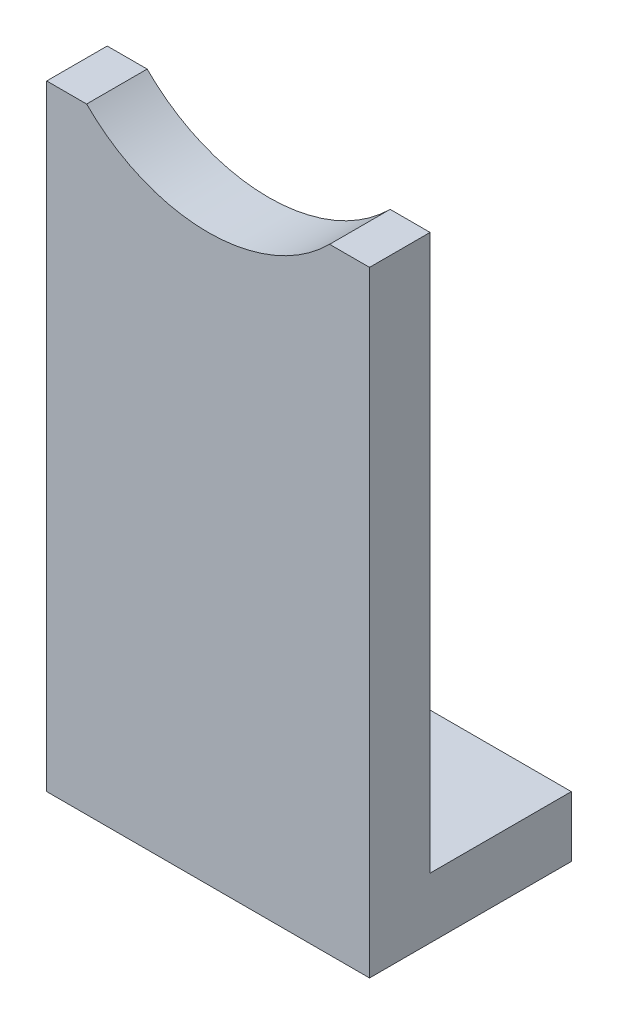
ISO-10303-21;
HEADER;
FILE_DESCRIPTION(('STEP AP214'),'2;1');
FILE_NAME('part.step','',(''),(''),'','','');
FILE_SCHEMA(('AUTOMOTIVE_DESIGN { 1 0 10303 214 1 1 1 1 }'));
ENDSEC;
DATA;
#1=APPLICATION_CONTEXT('core data for automotive mechanical design processes');
#2=APPLICATION_PROTOCOL_DEFINITION('international standard','automotive_design',2000,#1);
#3=PRODUCT_CONTEXT('',#1,'mechanical');
#4=PRODUCT('Part','Part','',(#3));
#5=PRODUCT_RELATED_PRODUCT_CATEGORY('part','',(#4));
#6=PRODUCT_DEFINITION_FORMATION('','',#4);
#7=PRODUCT_DEFINITION_CONTEXT('part definition',#1,'design');
#8=PRODUCT_DEFINITION('design','',#6,#7);
#9=PRODUCT_DEFINITION_SHAPE('','',#8);
#10=(LENGTH_UNIT() NAMED_UNIT(*) SI_UNIT(.MILLI.,.METRE.));
#11=(NAMED_UNIT(*) PLANE_ANGLE_UNIT() SI_UNIT($,.RADIAN.));
#12=(NAMED_UNIT(*) SI_UNIT($,.STERADIAN.) SOLID_ANGLE_UNIT());
#13=UNCERTAINTY_MEASURE_WITH_UNIT(LENGTH_MEASURE(1.E-05),#10,'distance_accuracy_value','');
#14=(GEOMETRIC_REPRESENTATION_CONTEXT(3) GLOBAL_UNCERTAINTY_ASSIGNED_CONTEXT((#13)) GLOBAL_UNIT_ASSIGNED_CONTEXT((#10,
#11,#12)) REPRESENTATION_CONTEXT('',''));
#15=CARTESIAN_POINT('',(0.,0.,0.));
#16=DIRECTION('',(0.,0.,1.));
#17=DIRECTION('',(1.,0.,0.));
#18=AXIS2_PLACEMENT_3D('',#15,#16,#17);
#19=CARTESIAN_POINT('',(0.,61.,0.));
#20=DIRECTION('',(0.,1.,0.));
#21=DIRECTION('',(0.,0.,1.));
#22=AXIS2_PLACEMENT_3D('',#19,#20,#21);
#23=PLANE('',#22);
#24=DIRECTION('',(0.,0.,1.));
#25=VECTOR('',#24,1.);
#26=CARTESIAN_POINT('',(-12.0415945787923,61.,-56.5606936416204));
#27=LINE('',#26,#25);
#28=CARTESIAN_POINT('',(-12.0415945787923,61.,-7.56069364162039));
#29=VERTEX_POINT('',#28);
#30=CARTESIAN_POINT('',(-12.0415945787923,61.,-1.56069364162039));
#31=VERTEX_POINT('',#30);
#32=EDGE_CURVE('E11',#29,#31,#27,.T.);
#33=ORIENTED_EDGE('',*,*,#32,.F.);
#34=DIRECTION('',(-1.,0.,0.));
#35=VECTOR('',#34,1.);
#36=CARTESIAN_POINT('',(16.,61.,-7.56069364162039));
#37=LINE('',#36,#35);
#38=CARTESIAN_POINT('',(-16.,61.,-7.56069364162039));
#39=VERTEX_POINT('',#38);
#40=EDGE_CURVE('E185',#29,#39,#37,.T.);
#41=ORIENTED_EDGE('',*,*,#40,.T.);
#42=DIRECTION('',(0.,0.,1.));
#43=VECTOR('',#42,1.);
#44=CARTESIAN_POINT('',(-16.,61.,-1.56069364162039));
#45=LINE('',#44,#43);
#46=CARTESIAN_POINT('',(-16.,61.,-1.56069364162039));
#47=VERTEX_POINT('',#46);
#48=EDGE_CURVE('E113',#39,#47,#45,.T.);
#49=ORIENTED_EDGE('',*,*,#48,.T.);
#50=DIRECTION('',(1.,0.,0.));
#51=VECTOR('',#50,1.);
#52=CARTESIAN_POINT('',(16.,61.,-1.56069364162039));
#53=LINE('',#52,#51);
#54=EDGE_CURVE('E107',#47,#31,#53,.T.);
#55=ORIENTED_EDGE('',*,*,#54,.T.);
#56=EDGE_LOOP('',(#33,#41,#49,#55));
#57=FACE_BOUND('',#56,.T.);
#58=ADVANCED_FACE('F34',(#57),#23,.T.);
#59=CARTESIAN_POINT('',(16.,6.,-21.5606936416204));
#60=DIRECTION('',(-1.,0.,0.));
#61=DIRECTION('',(0.,0.,1.));
#62=AXIS2_PLACEMENT_3D('',#59,#60,#61);
#63=PLANE('',#62);
#64=DIRECTION('',(0.,0.,-1.));
#65=VECTOR('',#64,1.);
#66=CARTESIAN_POINT('',(16.,0.,-21.5606936416204));
#67=LINE('',#66,#65);
#68=CARTESIAN_POINT('',(16.,0.,-1.56069364162039));
#69=VERTEX_POINT('',#68);
#70=CARTESIAN_POINT('',(16.,0.,-21.5606936416204));
#71=VERTEX_POINT('',#70);
#72=EDGE_CURVE('E137',#69,#71,#67,.T.);
#73=ORIENTED_EDGE('',*,*,#72,.T.);
#74=DIRECTION('',(0.,-1.,0.));
#75=VECTOR('',#74,1.);
#76=CARTESIAN_POINT('',(16.,6.,-21.5606936416204));
#77=LINE('',#76,#75);
#78=CARTESIAN_POINT('',(16.,6.,-21.5606936416204));
#79=VERTEX_POINT('',#78);
#80=EDGE_CURVE('E139',#79,#71,#77,.T.);
#81=ORIENTED_EDGE('',*,*,#80,.F.);
#82=DIRECTION('',(0.,0.,-1.));
#83=VECTOR('',#82,1.);
#84=CARTESIAN_POINT('',(16.,6.,-21.5606936416204));
#85=LINE('',#84,#83);
#86=CARTESIAN_POINT('',(16.,6.,-7.56069364162039));
#87=VERTEX_POINT('',#86);
#88=EDGE_CURVE('E151',#87,#79,#85,.T.);
#89=ORIENTED_EDGE('',*,*,#88,.F.);
#90=DIRECTION('',(0.,-1.,0.));
#91=VECTOR('',#90,1.);
#92=CARTESIAN_POINT('',(16.,61.,-7.56069364162039));
#93=LINE('',#92,#91);
#94=CARTESIAN_POINT('',(16.,61.,-7.56069364162039));
#95=VERTEX_POINT('',#94);
#96=EDGE_CURVE('E117',#95,#87,#93,.T.);
#97=ORIENTED_EDGE('',*,*,#96,.F.);
#98=DIRECTION('',(0.,0.,-1.));
#99=VECTOR('',#98,1.);
#100=CARTESIAN_POINT('',(16.,61.,-1.56069364162039));
#101=LINE('',#100,#99);
#102=CARTESIAN_POINT('',(16.,61.,-1.56069364162039));
#103=VERTEX_POINT('',#102);
#104=EDGE_CURVE('E128',#103,#95,#101,.T.);
#105=ORIENTED_EDGE('',*,*,#104,.F.);
#106=DIRECTION('',(0.,-1.,0.));
#107=VECTOR('',#106,1.);
#108=CARTESIAN_POINT('',(16.,6.,-1.56069364162039));
#109=LINE('',#108,#107);
#110=EDGE_CURVE('E162',#103,#69,#109,.T.);
#111=ORIENTED_EDGE('',*,*,#110,.T.);
#112=EDGE_LOOP('',(#73,#81,#89,#97,#105,#111));
#113=FACE_BOUND('',#112,.T.);
#114=ADVANCED_FACE('F36',(#113),#63,.F.);
#115=CARTESIAN_POINT('',(-16.,6.,-21.5606936416204));
#116=DIRECTION('',(0.,0.,1.));
#117=DIRECTION('',(1.,0.,0.));
#118=AXIS2_PLACEMENT_3D('',#115,#116,#117);
#119=PLANE('',#118);
#120=DIRECTION('',(-1.,0.,0.));
#121=VECTOR('',#120,1.);
#122=CARTESIAN_POINT('',(-16.,0.,-21.5606936416204));
#123=LINE('',#122,#121);
#124=CARTESIAN_POINT('',(-16.,0.,-21.5606936416204));
#125=VERTEX_POINT('',#124);
#126=EDGE_CURVE('E158',#71,#125,#123,.T.);
#127=ORIENTED_EDGE('',*,*,#126,.T.);
#128=DIRECTION('',(0.,-1.,0.));
#129=VECTOR('',#128,1.);
#130=CARTESIAN_POINT('',(-16.,6.,-21.5606936416204));
#131=LINE('',#130,#129);
#132=CARTESIAN_POINT('',(-16.,6.,-21.5606936416204));
#133=VERTEX_POINT('',#132);
#134=EDGE_CURVE('E141',#133,#125,#131,.T.);
#135=ORIENTED_EDGE('',*,*,#134,.F.);
#136=DIRECTION('',(-1.,0.,0.));
#137=VECTOR('',#136,1.);
#138=CARTESIAN_POINT('',(-16.,6.,-21.5606936416204));
#139=LINE('',#138,#137);
#140=EDGE_CURVE('E152',#79,#133,#139,.T.);
#141=ORIENTED_EDGE('',*,*,#140,.F.);
#142=ORIENTED_EDGE('',*,*,#80,.T.);
#143=EDGE_LOOP('',(#127,#135,#141,#142));
#144=FACE_BOUND('',#143,.T.);
#145=ADVANCED_FACE('F172',(#144),#119,.F.);
#146=CARTESIAN_POINT('',(-16.,6.,-21.5606936416204));
#147=DIRECTION('',(1.,0.,0.));
#148=DIRECTION('',(0.,0.,-1.));
#149=AXIS2_PLACEMENT_3D('',#146,#147,#148);
#150=PLANE('',#149);
#151=DIRECTION('',(0.,0.,1.));
#152=VECTOR('',#151,1.);
#153=CARTESIAN_POINT('',(-16.,0.,-21.5606936416204));
#154=LINE('',#153,#152);
#155=CARTESIAN_POINT('',(-16.,0.,-1.56069364162039));
#156=VERTEX_POINT('',#155);
#157=EDGE_CURVE('E154',#125,#156,#154,.T.);
#158=ORIENTED_EDGE('',*,*,#157,.T.);
#159=DIRECTION('',(0.,-1.,0.));
#160=VECTOR('',#159,1.);
#161=CARTESIAN_POINT('',(-16.,6.,-1.56069364162039));
#162=LINE('',#161,#160);
#163=EDGE_CURVE('E148',#47,#156,#162,.T.);
#164=ORIENTED_EDGE('',*,*,#163,.F.);
#165=ORIENTED_EDGE('',*,*,#48,.F.);
#166=DIRECTION('',(0.,-1.,0.));
#167=VECTOR('',#166,1.);
#168=CARTESIAN_POINT('',(-16.,61.,-7.56069364162039));
#169=LINE('',#168,#167);
#170=CARTESIAN_POINT('',(-16.,6.,-7.56069364162039));
#171=VERTEX_POINT('',#170);
#172=EDGE_CURVE('E114',#39,#171,#169,.T.);
#173=ORIENTED_EDGE('',*,*,#172,.T.);
#174=DIRECTION('',(0.,0.,1.));
#175=VECTOR('',#174,1.);
#176=CARTESIAN_POINT('',(-16.,6.,-21.5606936416204));
#177=LINE('',#176,#175);
#178=EDGE_CURVE('E129',#133,#171,#177,.T.);
#179=ORIENTED_EDGE('',*,*,#178,.F.);
#180=ORIENTED_EDGE('',*,*,#134,.T.);
#181=EDGE_LOOP('',(#158,#164,#165,#173,#179,#180));
#182=FACE_BOUND('',#181,.T.);
#183=ADVANCED_FACE('F174',(#182),#150,.F.);
#184=CARTESIAN_POINT('',(-16.,6.,-1.56069364162039));
#185=DIRECTION('',(0.,0.,-1.));
#186=DIRECTION('',(-1.,0.,0.));
#187=AXIS2_PLACEMENT_3D('',#184,#185,#186);
#188=PLANE('',#187);
#189=CARTESIAN_POINT('',(12.0415945787923,61.,-1.56069364162039));
#190=VERTEX_POINT('',#189);
#191=EDGE_CURVE('E109',#190,#103,#53,.T.);
#192=ORIENTED_EDGE('',*,*,#191,.F.);
#193=CARTESIAN_POINT('',(0.,73.,-1.56069364162039));
#194=DIRECTION('',(0.,0.,1.));
#195=DIRECTION('',(1.,0.,0.));
#196=AXIS2_PLACEMENT_3D('',#193,#194,#195);
#197=CIRCLE('',#196,17.);
#198=EDGE_CURVE('E48',#31,#190,#197,.T.);
#199=ORIENTED_EDGE('',*,*,#198,.F.);
#200=ORIENTED_EDGE('',*,*,#54,.F.);
#201=ORIENTED_EDGE('',*,*,#163,.T.);
#202=DIRECTION('',(1.,0.,0.));
#203=VECTOR('',#202,1.);
#204=CARTESIAN_POINT('',(-16.,0.,-1.56069364162039));
#205=LINE('',#204,#203);
#206=EDGE_CURVE('E153',#156,#69,#205,.T.);
#207=ORIENTED_EDGE('',*,*,#206,.T.);
#208=ORIENTED_EDGE('',*,*,#110,.F.);
#209=EDGE_LOOP('',(#192,#199,#200,#201,#207,#208));
#210=FACE_BOUND('',#209,.T.);
#211=ADVANCED_FACE('F105',(#210),#188,.F.);
#212=CARTESIAN_POINT('',(0.,6.,0.));
#213=DIRECTION('',(0.,1.,0.));
#214=DIRECTION('',(0.,0.,1.));
#215=AXIS2_PLACEMENT_3D('',#212,#213,#214);
#216=PLANE('',#215);
#217=DIRECTION('',(-1.,0.,0.));
#218=VECTOR('',#217,1.);
#219=CARTESIAN_POINT('',(16.,6.,-7.56069364162039));
#220=LINE('',#219,#218);
#221=EDGE_CURVE('E56',#87,#171,#220,.T.);
#222=ORIENTED_EDGE('',*,*,#221,.F.);
#223=ORIENTED_EDGE('',*,*,#88,.T.);
#224=ORIENTED_EDGE('',*,*,#140,.T.);
#225=ORIENTED_EDGE('',*,*,#178,.T.);
#226=EDGE_LOOP('',(#222,#223,#224,#225));
#227=FACE_BOUND('',#226,.T.);
#228=ADVANCED_FACE('F176',(#227),#216,.T.);
#229=CARTESIAN_POINT('',(0.,0.,0.));
#230=DIRECTION('',(0.,1.,0.));
#231=DIRECTION('',(0.,0.,1.));
#232=AXIS2_PLACEMENT_3D('',#229,#230,#231);
#233=PLANE('',#232);
#234=ORIENTED_EDGE('',*,*,#72,.F.);
#235=ORIENTED_EDGE('',*,*,#206,.F.);
#236=ORIENTED_EDGE('',*,*,#157,.F.);
#237=ORIENTED_EDGE('',*,*,#126,.F.);
#238=EDGE_LOOP('',(#234,#235,#236,#237));
#239=FACE_BOUND('',#238,.T.);
#240=ADVANCED_FACE('F167',(#239),#233,.F.);
#241=CARTESIAN_POINT('',(16.,61.,-7.56069364162039));
#242=DIRECTION('',(0.,0.,1.));
#243=DIRECTION('',(1.,0.,0.));
#244=AXIS2_PLACEMENT_3D('',#241,#242,#243);
#245=PLANE('',#244);
#246=ORIENTED_EDGE('',*,*,#40,.F.);
#247=CARTESIAN_POINT('',(0.,73.,-7.5606936416204));
#248=DIRECTION('',(0.,0.,1.));
#249=DIRECTION('',(1.,0.,0.));
#250=AXIS2_PLACEMENT_3D('',#247,#248,#249);
#251=CIRCLE('',#250,17.);
#252=CARTESIAN_POINT('',(12.0415945787923,61.,-7.56069364162039));
#253=VERTEX_POINT('',#252);
#254=EDGE_CURVE('E98',#29,#253,#251,.T.);
#255=ORIENTED_EDGE('',*,*,#254,.T.);
#256=EDGE_CURVE('E181',#95,#253,#37,.T.);
#257=ORIENTED_EDGE('',*,*,#256,.F.);
#258=ORIENTED_EDGE('',*,*,#96,.T.);
#259=ORIENTED_EDGE('',*,*,#221,.T.);
#260=ORIENTED_EDGE('',*,*,#172,.F.);
#261=EDGE_LOOP('',(#246,#255,#257,#258,#259,#260));
#262=FACE_BOUND('',#261,.T.);
#263=ADVANCED_FACE('F178',(#262),#245,.F.);
#264=DIRECTION('',(0.,0.,1.));
#265=VECTOR('',#264,1.);
#266=CARTESIAN_POINT('',(12.0415945787923,61.,-56.5606936416204));
#267=LINE('',#266,#265);
#268=EDGE_CURVE('E42',#190,#253,#267,.F.);
#269=ORIENTED_EDGE('',*,*,#268,.F.);
#270=ORIENTED_EDGE('',*,*,#191,.T.);
#271=ORIENTED_EDGE('',*,*,#104,.T.);
#272=ORIENTED_EDGE('',*,*,#256,.T.);
#273=EDGE_LOOP('',(#269,#270,#271,#272));
#274=FACE_BOUND('',#273,.T.);
#275=ADVANCED_FACE('F188',(#274),#23,.T.);
#276=CARTESIAN_POINT('',(0.,73.,-56.5606936416204));
#277=DIRECTION('',(0.,0.,1.));
#278=DIRECTION('',(1.,0.,0.));
#279=AXIS2_PLACEMENT_3D('',#276,#277,#278);
#280=CYLINDRICAL_SURFACE('',#279,17.);
#281=ORIENTED_EDGE('',*,*,#32,.T.);
#282=ORIENTED_EDGE('',*,*,#198,.T.);
#283=ORIENTED_EDGE('',*,*,#268,.T.);
#284=ORIENTED_EDGE('',*,*,#254,.F.);
#285=EDGE_LOOP('',(#281,#282,#283,#284));
#286=FACE_BOUND('',#285,.T.);
#287=ADVANCED_FACE('F96',(#286),#280,.F.);
#288=CLOSED_SHELL('',(#58,#114,#145,#183,#211,#228,#240,#263,#275,#287));
#289=MANIFOLD_SOLID_BREP('B2',#288);
#290=ADVANCED_BREP_SHAPE_REPRESENTATION('',(#18,#289),#14);
#291=SHAPE_DEFINITION_REPRESENTATION(#9,#290);
ENDSEC;
END-ISO-10303-21;
